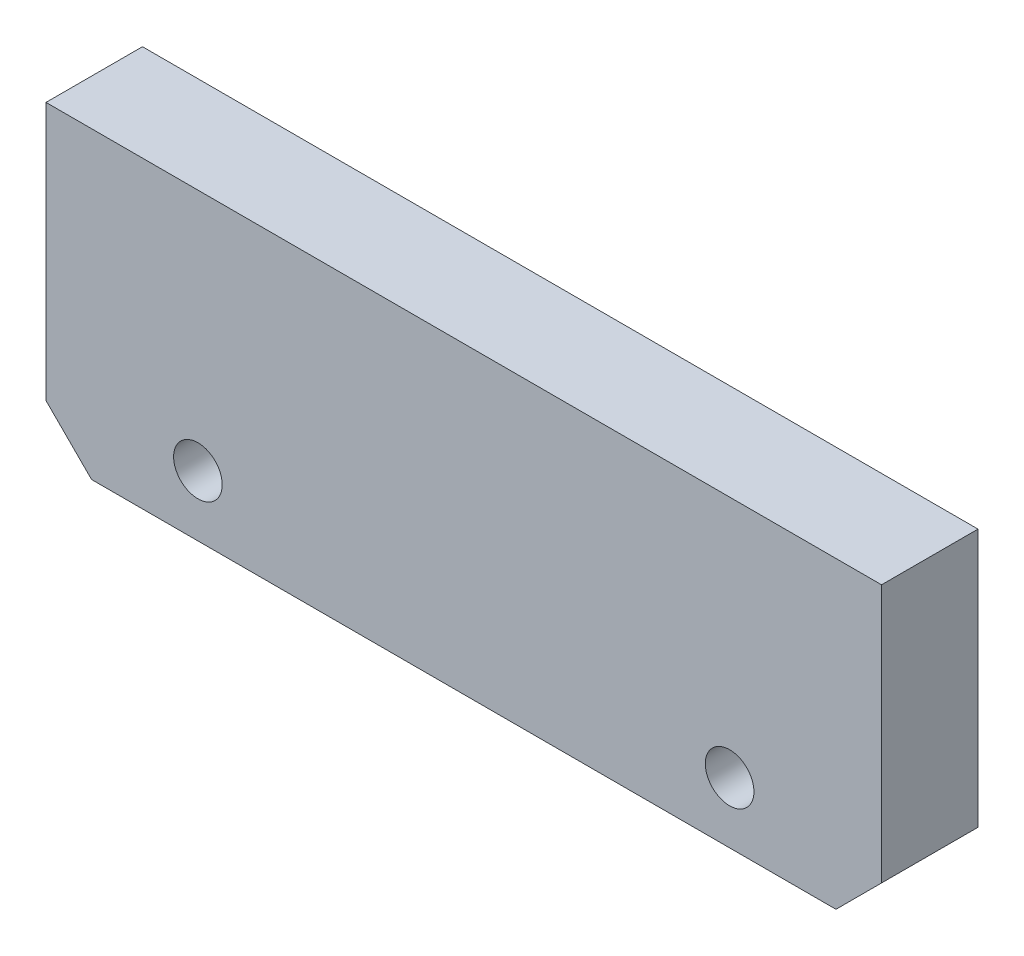
ISO-10303-21;
HEADER;
FILE_DESCRIPTION(('STEP AP214'),'2;1');
FILE_NAME('part.step','',(''),(''),'','','');
FILE_SCHEMA(('AUTOMOTIVE_DESIGN { 1 0 10303 214 1 1 1 1 }'));
ENDSEC;
DATA;
#1=APPLICATION_CONTEXT('core data for automotive mechanical design processes');
#2=APPLICATION_PROTOCOL_DEFINITION('international standard','automotive_design',2000,#1);
#3=PRODUCT_CONTEXT('',#1,'mechanical');
#4=PRODUCT('Part','Part','',(#3));
#5=PRODUCT_RELATED_PRODUCT_CATEGORY('part','',(#4));
#6=PRODUCT_DEFINITION_FORMATION('','',#4);
#7=PRODUCT_DEFINITION_CONTEXT('part definition',#1,'design');
#8=PRODUCT_DEFINITION('design','',#6,#7);
#9=PRODUCT_DEFINITION_SHAPE('','',#8);
#10=(LENGTH_UNIT() NAMED_UNIT(*) SI_UNIT(.MILLI.,.METRE.));
#11=(NAMED_UNIT(*) PLANE_ANGLE_UNIT() SI_UNIT($,.RADIAN.));
#12=(NAMED_UNIT(*) SI_UNIT($,.STERADIAN.) SOLID_ANGLE_UNIT());
#13=UNCERTAINTY_MEASURE_WITH_UNIT(LENGTH_MEASURE(1.E-05),#10,'distance_accuracy_value','');
#14=(GEOMETRIC_REPRESENTATION_CONTEXT(3) GLOBAL_UNCERTAINTY_ASSIGNED_CONTEXT((#13)) GLOBAL_UNIT_ASSIGNED_CONTEXT((#10,
#11,#12)) REPRESENTATION_CONTEXT('',''));
#15=CARTESIAN_POINT('',(0.,0.,0.));
#16=DIRECTION('',(0.,0.,1.));
#17=DIRECTION('',(1.,0.,0.));
#18=AXIS2_PLACEMENT_3D('',#15,#16,#17);
#19=CARTESIAN_POINT('',(0.,-20.,6.35));
#20=DIRECTION('',(1.,0.,0.));
#21=DIRECTION('',(0.,0.,-1.));
#22=AXIS2_PLACEMENT_3D('',#19,#20,#21);
#23=PLANE('',#22);
#24=DIRECTION('',(0.,-1.,0.));
#25=VECTOR('',#24,1.);
#26=CARTESIAN_POINT('',(0.,-20.,0.));
#27=LINE('',#26,#25);
#28=CARTESIAN_POINT('',(0.,0.,0.));
#29=VERTEX_POINT('',#28);
#30=CARTESIAN_POINT('',(0.,-17.,0.));
#31=VERTEX_POINT('',#30);
#32=EDGE_CURVE('E118',#29,#31,#27,.T.);
#33=ORIENTED_EDGE('',*,*,#32,.T.);
#34=DIRECTION('',(0.,0.,1.));
#35=VECTOR('',#34,1.);
#36=CARTESIAN_POINT('',(0.,-17.,6.35));
#37=LINE('',#36,#35);
#38=CARTESIAN_POINT('',(0.,-17.,6.35));
#39=VERTEX_POINT('',#38);
#40=EDGE_CURVE('E11',#31,#39,#37,.T.);
#41=ORIENTED_EDGE('',*,*,#40,.T.);
#42=DIRECTION('',(0.,-1.,0.));
#43=VECTOR('',#42,1.);
#44=CARTESIAN_POINT('',(0.,-20.,6.35));
#45=LINE('',#44,#43);
#46=CARTESIAN_POINT('',(0.,0.,6.35));
#47=VERTEX_POINT('',#46);
#48=EDGE_CURVE('E125',#47,#39,#45,.T.);
#49=ORIENTED_EDGE('',*,*,#48,.F.);
#50=DIRECTION('',(0.,0.,-1.));
#51=VECTOR('',#50,1.);
#52=CARTESIAN_POINT('',(0.,0.,6.35));
#53=LINE('',#52,#51);
#54=EDGE_CURVE('E110',#47,#29,#53,.T.);
#55=ORIENTED_EDGE('',*,*,#54,.T.);
#56=EDGE_LOOP('',(#33,#41,#49,#55));
#57=FACE_BOUND('',#56,.T.);
#58=ADVANCED_FACE('F36',(#57),#23,.F.);
#59=CARTESIAN_POINT('',(55.,-20.,6.35));
#60=DIRECTION('',(0.,1.,0.));
#61=DIRECTION('',(0.,0.,1.));
#62=AXIS2_PLACEMENT_3D('',#59,#60,#61);
#63=PLANE('',#62);
#64=DIRECTION('',(1.,0.,0.));
#65=VECTOR('',#64,1.);
#66=CARTESIAN_POINT('',(55.,-20.,0.));
#67=LINE('',#66,#65);
#68=CARTESIAN_POINT('',(3.,-20.,0.));
#69=VERTEX_POINT('',#68);
#70=CARTESIAN_POINT('',(52.,-20.,0.));
#71=VERTEX_POINT('',#70);
#72=EDGE_CURVE('E120',#69,#71,#67,.T.);
#73=ORIENTED_EDGE('',*,*,#72,.T.);
#74=DIRECTION('',(0.,0.,1.));
#75=VECTOR('',#74,1.);
#76=CARTESIAN_POINT('',(52.,-20.,6.35));
#77=LINE('',#76,#75);
#78=CARTESIAN_POINT('',(52.,-20.,6.35));
#79=VERTEX_POINT('',#78);
#80=EDGE_CURVE('E57',#71,#79,#77,.T.);
#81=ORIENTED_EDGE('',*,*,#80,.T.);
#82=DIRECTION('',(1.,0.,0.));
#83=VECTOR('',#82,1.);
#84=CARTESIAN_POINT('',(55.,-20.,6.35));
#85=LINE('',#84,#83);
#86=CARTESIAN_POINT('',(3.,-20.,6.35));
#87=VERTEX_POINT('',#86);
#88=EDGE_CURVE('E100',#87,#79,#85,.T.);
#89=ORIENTED_EDGE('',*,*,#88,.F.);
#90=DIRECTION('',(0.,0.,-1.));
#91=VECTOR('',#90,1.);
#92=CARTESIAN_POINT('',(3.,-20.,6.35));
#93=LINE('',#92,#91);
#94=EDGE_CURVE('E132',#87,#69,#93,.T.);
#95=ORIENTED_EDGE('',*,*,#94,.T.);
#96=EDGE_LOOP('',(#73,#81,#89,#95));
#97=FACE_BOUND('',#96,.T.);
#98=ADVANCED_FACE('F140',(#97),#63,.F.);
#99=CARTESIAN_POINT('',(55.,0.,6.35));
#100=DIRECTION('',(-1.,0.,0.));
#101=DIRECTION('',(0.,0.,1.));
#102=AXIS2_PLACEMENT_3D('',#99,#100,#101);
#103=PLANE('',#102);
#104=DIRECTION('',(0.,1.,0.));
#105=VECTOR('',#104,1.);
#106=CARTESIAN_POINT('',(55.,0.,6.35));
#107=LINE('',#106,#105);
#108=CARTESIAN_POINT('',(55.,-17.,6.35));
#109=VERTEX_POINT('',#108);
#110=CARTESIAN_POINT('',(55.,0.,6.35));
#111=VERTEX_POINT('',#110);
#112=EDGE_CURVE('E90',#109,#111,#107,.T.);
#113=ORIENTED_EDGE('',*,*,#112,.F.);
#114=DIRECTION('',(0.,0.,-1.));
#115=VECTOR('',#114,1.);
#116=CARTESIAN_POINT('',(55.,-17.,6.35));
#117=LINE('',#116,#115);
#118=CARTESIAN_POINT('',(55.,-17.,0.));
#119=VERTEX_POINT('',#118);
#120=EDGE_CURVE('E109',#109,#119,#117,.T.);
#121=ORIENTED_EDGE('',*,*,#120,.T.);
#122=DIRECTION('',(0.,1.,0.));
#123=VECTOR('',#122,1.);
#124=CARTESIAN_POINT('',(55.,0.,0.));
#125=LINE('',#124,#123);
#126=CARTESIAN_POINT('',(55.,0.,0.));
#127=VERTEX_POINT('',#126);
#128=EDGE_CURVE('E106',#119,#127,#125,.T.);
#129=ORIENTED_EDGE('',*,*,#128,.T.);
#130=DIRECTION('',(0.,0.,-1.));
#131=VECTOR('',#130,1.);
#132=CARTESIAN_POINT('',(55.,0.,6.35));
#133=LINE('',#132,#131);
#134=EDGE_CURVE('E103',#111,#127,#133,.T.);
#135=ORIENTED_EDGE('',*,*,#134,.F.);
#136=EDGE_LOOP('',(#113,#121,#129,#135));
#137=FACE_BOUND('',#136,.T.);
#138=ADVANCED_FACE('F104',(#137),#103,.F.);
#139=CARTESIAN_POINT('',(0.,0.,6.35));
#140=DIRECTION('',(0.,-1.,0.));
#141=DIRECTION('',(0.,0.,-1.));
#142=AXIS2_PLACEMENT_3D('',#139,#140,#141);
#143=PLANE('',#142);
#144=DIRECTION('',(-1.,0.,0.));
#145=VECTOR('',#144,1.);
#146=CARTESIAN_POINT('',(0.,0.,0.));
#147=LINE('',#146,#145);
#148=EDGE_CURVE('E124',#127,#29,#147,.T.);
#149=ORIENTED_EDGE('',*,*,#148,.T.);
#150=ORIENTED_EDGE('',*,*,#54,.F.);
#151=DIRECTION('',(-1.,0.,0.));
#152=VECTOR('',#151,1.);
#153=CARTESIAN_POINT('',(0.,0.,6.35));
#154=LINE('',#153,#152);
#155=EDGE_CURVE('E94',#111,#47,#154,.T.);
#156=ORIENTED_EDGE('',*,*,#155,.F.);
#157=ORIENTED_EDGE('',*,*,#134,.T.);
#158=EDGE_LOOP('',(#149,#150,#156,#157));
#159=FACE_BOUND('',#158,.T.);
#160=ADVANCED_FACE('F112',(#159),#143,.F.);
#161=CARTESIAN_POINT('',(0.,0.,6.35));
#162=DIRECTION('',(0.,0.,-1.));
#163=DIRECTION('',(-1.,0.,0.));
#164=AXIS2_PLACEMENT_3D('',#161,#162,#163);
#165=PLANE('',#164);
#166=CARTESIAN_POINT('',(10.,-16.,6.35));
#167=DIRECTION('',(0.,0.,1.));
#168=DIRECTION('',(1.,0.,0.));
#169=AXIS2_PLACEMENT_3D('',#166,#167,#168);
#170=CIRCLE('',#169,1.6);
#171=CARTESIAN_POINT('',(11.6,-16.,6.35));
#172=VERTEX_POINT('',#171);
#173=EDGE_CURVE('E155',#172,#172,#170,.T.);
#174=ORIENTED_EDGE('',*,*,#173,.F.);
#175=EDGE_LOOP('',(#174));
#176=FACE_BOUND('',#175,.T.);
#177=CARTESIAN_POINT('',(45.,-16.,6.35));
#178=DIRECTION('',(0.,0.,1.));
#179=DIRECTION('',(1.,0.,0.));
#180=AXIS2_PLACEMENT_3D('',#177,#178,#179);
#181=CIRCLE('',#180,1.6);
#182=CARTESIAN_POINT('',(46.6,-16.,6.35));
#183=VERTEX_POINT('',#182);
#184=EDGE_CURVE('E149',#183,#183,#181,.T.);
#185=ORIENTED_EDGE('',*,*,#184,.F.);
#186=EDGE_LOOP('',(#185));
#187=FACE_BOUND('',#186,.T.);
#188=ORIENTED_EDGE('',*,*,#88,.T.);
#189=DIRECTION('',(-0.707106781186549,-0.707106781186546,0.));
#190=VECTOR('',#189,1.);
#191=CARTESIAN_POINT('',(55.,-17.,6.35));
#192=LINE('',#191,#190);
#193=EDGE_CURVE('E44',#79,#109,#192,.F.);
#194=ORIENTED_EDGE('',*,*,#193,.T.);
#195=ORIENTED_EDGE('',*,*,#112,.T.);
#196=ORIENTED_EDGE('',*,*,#155,.T.);
#197=ORIENTED_EDGE('',*,*,#48,.T.);
#198=DIRECTION('',(-0.707106781186546,0.707106781186549,0.));
#199=VECTOR('',#198,1.);
#200=CARTESIAN_POINT('',(3.,-20.,6.35));
#201=LINE('',#200,#199);
#202=EDGE_CURVE('E136',#39,#87,#201,.F.);
#203=ORIENTED_EDGE('',*,*,#202,.T.);
#204=EDGE_LOOP('',(#188,#194,#195,#196,#197,#203));
#205=FACE_BOUND('',#204,.T.);
#206=ADVANCED_FACE('F92',(#176,#187,#205),#165,.F.);
#207=CARTESIAN_POINT('',(0.,0.,0.));
#208=DIRECTION('',(0.,0.,-1.));
#209=DIRECTION('',(-1.,0.,0.));
#210=AXIS2_PLACEMENT_3D('',#207,#208,#209);
#211=PLANE('',#210);
#212=CARTESIAN_POINT('',(10.,-16.,0.));
#213=DIRECTION('',(0.,0.,1.));
#214=DIRECTION('',(1.,0.,0.));
#215=AXIS2_PLACEMENT_3D('',#212,#213,#214);
#216=CIRCLE('',#215,1.6);
#217=CARTESIAN_POINT('',(11.6,-16.,0.));
#218=VERTEX_POINT('',#217);
#219=EDGE_CURVE('E152',#218,#218,#216,.T.);
#220=ORIENTED_EDGE('',*,*,#219,.T.);
#221=EDGE_LOOP('',(#220));
#222=FACE_BOUND('',#221,.T.);
#223=CARTESIAN_POINT('',(45.,-16.,0.));
#224=DIRECTION('',(0.,0.,1.));
#225=DIRECTION('',(1.,0.,0.));
#226=AXIS2_PLACEMENT_3D('',#223,#224,#225);
#227=CIRCLE('',#226,1.6);
#228=CARTESIAN_POINT('',(46.6,-16.,0.));
#229=VERTEX_POINT('',#228);
#230=EDGE_CURVE('E121',#229,#229,#227,.T.);
#231=ORIENTED_EDGE('',*,*,#230,.T.);
#232=EDGE_LOOP('',(#231));
#233=FACE_BOUND('',#232,.T.);
#234=ORIENTED_EDGE('',*,*,#128,.F.);
#235=DIRECTION('',(0.707106781186549,0.707106781186546,0.));
#236=VECTOR('',#235,1.);
#237=CARTESIAN_POINT('',(35.9999999999999,-36.,0.));
#238=LINE('',#237,#236);
#239=EDGE_CURVE('E130',#119,#71,#238,.F.);
#240=ORIENTED_EDGE('',*,*,#239,.T.);
#241=ORIENTED_EDGE('',*,*,#72,.F.);
#242=DIRECTION('',(0.707106781186546,-0.707106781186549,0.));
#243=VECTOR('',#242,1.);
#244=CARTESIAN_POINT('',(-8.49999999999999,-8.49999999999995,0.));
#245=LINE('',#244,#243);
#246=EDGE_CURVE('E128',#69,#31,#245,.F.);
#247=ORIENTED_EDGE('',*,*,#246,.T.);
#248=ORIENTED_EDGE('',*,*,#32,.F.);
#249=ORIENTED_EDGE('',*,*,#148,.F.);
#250=EDGE_LOOP('',(#234,#240,#241,#247,#248,#249));
#251=FACE_BOUND('',#250,.T.);
#252=ADVANCED_FACE('F144',(#222,#233,#251),#211,.T.);
#253=CARTESIAN_POINT('',(45.,-16.,6.35));
#254=DIRECTION('',(0.,0.,1.));
#255=DIRECTION('',(1.,0.,0.));
#256=AXIS2_PLACEMENT_3D('',#253,#254,#255);
#257=CYLINDRICAL_SURFACE('',#256,1.6);
#258=ORIENTED_EDGE('',*,*,#230,.F.);
#259=EDGE_LOOP('',(#258));
#260=FACE_BOUND('',#259,.T.);
#261=ORIENTED_EDGE('',*,*,#184,.T.);
#262=EDGE_LOOP('',(#261));
#263=FACE_BOUND('',#262,.T.);
#264=ADVANCED_FACE('F166',(#260,#263),#257,.F.);
#265=CARTESIAN_POINT('',(10.,-16.,6.35));
#266=DIRECTION('',(0.,0.,1.));
#267=DIRECTION('',(1.,0.,0.));
#268=AXIS2_PLACEMENT_3D('',#265,#266,#267);
#269=CYLINDRICAL_SURFACE('',#268,1.6);
#270=ORIENTED_EDGE('',*,*,#219,.F.);
#271=EDGE_LOOP('',(#270));
#272=FACE_BOUND('',#271,.T.);
#273=ORIENTED_EDGE('',*,*,#173,.T.);
#274=EDGE_LOOP('',(#273));
#275=FACE_BOUND('',#274,.T.);
#276=ADVANCED_FACE('F159',(#272,#275),#269,.F.);
#277=CARTESIAN_POINT('',(55.,-17.,6.35));
#278=DIRECTION('',(-0.707106781186546,0.707106781186549,0.));
#279=DIRECTION('',(0.,0.,-1.));
#280=AXIS2_PLACEMENT_3D('',#277,#278,#279);
#281=PLANE('',#280);
#282=ORIENTED_EDGE('',*,*,#193,.F.);
#283=ORIENTED_EDGE('',*,*,#80,.F.);
#284=ORIENTED_EDGE('',*,*,#239,.F.);
#285=ORIENTED_EDGE('',*,*,#120,.F.);
#286=EDGE_LOOP('',(#282,#283,#284,#285));
#287=FACE_BOUND('',#286,.T.);
#288=ADVANCED_FACE('F174',(#287),#281,.F.);
#289=CARTESIAN_POINT('',(3.,-20.,6.35));
#290=DIRECTION('',(0.707106781186549,0.707106781186546,0.));
#291=DIRECTION('',(0.,0.,-1.));
#292=AXIS2_PLACEMENT_3D('',#289,#290,#291);
#293=PLANE('',#292);
#294=ORIENTED_EDGE('',*,*,#202,.F.);
#295=ORIENTED_EDGE('',*,*,#40,.F.);
#296=ORIENTED_EDGE('',*,*,#246,.F.);
#297=ORIENTED_EDGE('',*,*,#94,.F.);
#298=EDGE_LOOP('',(#294,#295,#296,#297));
#299=FACE_BOUND('',#298,.T.);
#300=ADVANCED_FACE('F38',(#299),#293,.F.);
#301=CLOSED_SHELL('',(#58,#98,#138,#160,#206,#252,#264,#276,#288,#300));
#302=MANIFOLD_SOLID_BREP('B2',#301);
#303=ADVANCED_BREP_SHAPE_REPRESENTATION('',(#18,#302),#14);
#304=SHAPE_DEFINITION_REPRESENTATION(#9,#303);
ENDSEC;
END-ISO-10303-21;
